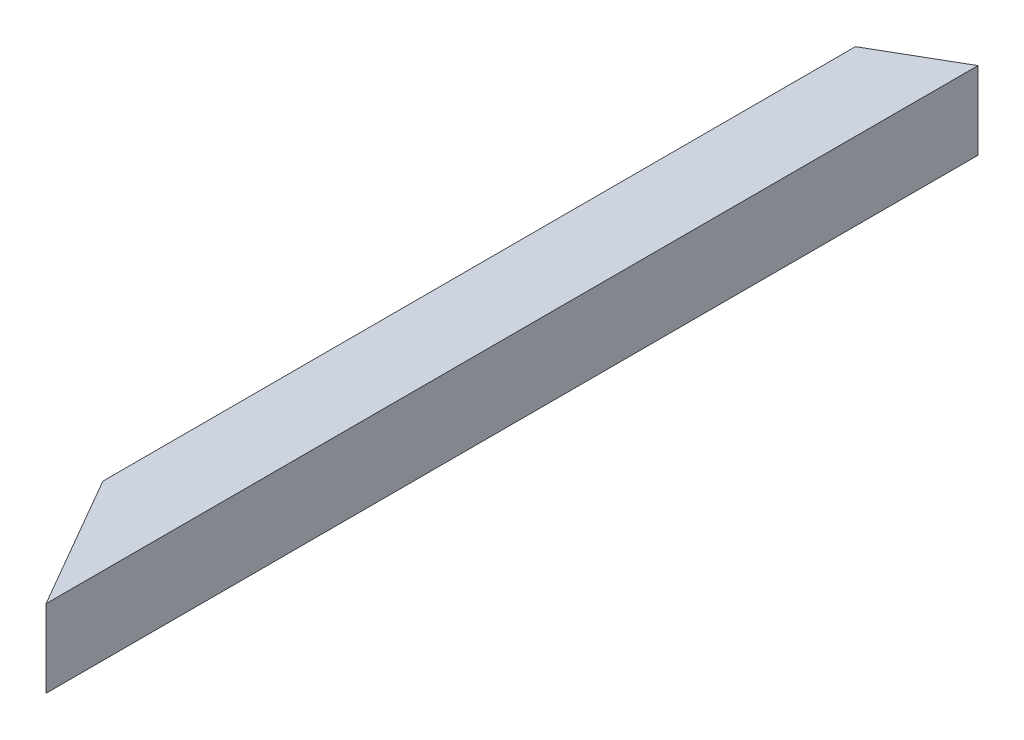
ISO-10303-21;
HEADER;
FILE_DESCRIPTION(('STEP AP214'),'2;1');
FILE_NAME('part.step','',(''),(''),'','','');
FILE_SCHEMA(('AUTOMOTIVE_DESIGN { 1 0 10303 214 1 1 1 1 }'));
ENDSEC;
DATA;
#1=APPLICATION_CONTEXT('core data for automotive mechanical design processes');
#2=APPLICATION_PROTOCOL_DEFINITION('international standard','automotive_design',2000,#1);
#3=PRODUCT_CONTEXT('',#1,'mechanical');
#4=PRODUCT('Part','Part','',(#3));
#5=PRODUCT_RELATED_PRODUCT_CATEGORY('part','',(#4));
#6=PRODUCT_DEFINITION_FORMATION('','',#4);
#7=PRODUCT_DEFINITION_CONTEXT('part definition',#1,'design');
#8=PRODUCT_DEFINITION('design','',#6,#7);
#9=PRODUCT_DEFINITION_SHAPE('','',#8);
#10=(LENGTH_UNIT() NAMED_UNIT(*) SI_UNIT(.MILLI.,.METRE.));
#11=(NAMED_UNIT(*) PLANE_ANGLE_UNIT() SI_UNIT($,.RADIAN.));
#12=(NAMED_UNIT(*) SI_UNIT($,.STERADIAN.) SOLID_ANGLE_UNIT());
#13=UNCERTAINTY_MEASURE_WITH_UNIT(LENGTH_MEASURE(1.E-05),#10,'distance_accuracy_value','');
#14=(GEOMETRIC_REPRESENTATION_CONTEXT(3) GLOBAL_UNCERTAINTY_ASSIGNED_CONTEXT((#13)) GLOBAL_UNIT_ASSIGNED_CONTEXT((#10,
#11,#12)) REPRESENTATION_CONTEXT('',''));
#15=CARTESIAN_POINT('',(0.,0.,0.));
#16=DIRECTION('',(0.,0.,1.));
#17=DIRECTION('',(1.,0.,0.));
#18=AXIS2_PLACEMENT_3D('',#15,#16,#17);
#19=CARTESIAN_POINT('',(1.,19.,240.));
#20=DIRECTION('',(0.,-1.,0.));
#21=DIRECTION('',(0.,0.,-1.));
#22=AXIS2_PLACEMENT_3D('',#19,#20,#21);
#23=PLANE('',#22);
#24=DIRECTION('',(-0.866025403784438,0.,0.500000000000001));
#25=VECTOR('',#24,1.);
#26=CARTESIAN_POINT('',(-98.1730484541328,19.,68.2272413359525));
#27=LINE('',#26,#25);
#28=CARTESIAN_POINT('',(19.,19.,0.577350269189675));
#29=VERTEX_POINT('',#28);
#30=CARTESIAN_POINT('',(0.999999999999987,19.,10.969655114603));
#31=VERTEX_POINT('',#30);
#32=EDGE_CURVE('E11',#29,#31,#27,.T.);
#33=ORIENTED_EDGE('',*,*,#32,.F.);
#34=DIRECTION('',(0.,0.,-1.));
#35=VECTOR('',#34,1.);
#36=CARTESIAN_POINT('',(19.,19.,240.));
#37=LINE('',#36,#35);
#38=CARTESIAN_POINT('',(19.,19.,238.267949192431));
#39=VERTEX_POINT('',#38);
#40=EDGE_CURVE('E142',#39,#29,#37,.T.);
#41=ORIENTED_EDGE('',*,*,#40,.F.);
#42=DIRECTION('',(0.500000000000005,0.,0.866025403784436));
#43=VECTOR('',#42,1.);
#44=CARTESIAN_POINT('',(15.2499999999999,19.,231.772758664048));
#45=LINE('',#44,#43);
#46=CARTESIAN_POINT('',(1.,19.,207.091034656192));
#47=VERTEX_POINT('',#46);
#48=EDGE_CURVE('E43',#47,#39,#45,.T.);
#49=ORIENTED_EDGE('',*,*,#48,.F.);
#50=DIRECTION('',(0.,0.,-1.));
#51=VECTOR('',#50,1.);
#52=CARTESIAN_POINT('',(1.,19.,240.));
#53=LINE('',#52,#51);
#54=EDGE_CURVE('E148',#47,#31,#53,.T.);
#55=ORIENTED_EDGE('',*,*,#54,.T.);
#56=EDGE_LOOP('',(#33,#41,#49,#55));
#57=FACE_BOUND('',#56,.T.);
#58=ADVANCED_FACE('F35',(#57),#23,.T.);
#59=CARTESIAN_POINT('',(19.,1.,240.));
#60=DIRECTION('',(-1.,0.,0.));
#61=DIRECTION('',(0.,0.,1.));
#62=AXIS2_PLACEMENT_3D('',#59,#60,#61);
#63=PLANE('',#62);
#64=DIRECTION('',(0.,1.,0.));
#65=VECTOR('',#64,1.);
#66=CARTESIAN_POINT('',(19.,1.,0.577350269189647));
#67=LINE('',#66,#65);
#68=CARTESIAN_POINT('',(19.,1.,0.577350269189647));
#69=VERTEX_POINT('',#68);
#70=EDGE_CURVE('E162',#69,#29,#67,.T.);
#71=ORIENTED_EDGE('',*,*,#70,.F.);
#72=DIRECTION('',(0.,0.,-1.));
#73=VECTOR('',#72,1.);
#74=CARTESIAN_POINT('',(19.,1.,240.));
#75=LINE('',#74,#73);
#76=CARTESIAN_POINT('',(19.,1.,238.267949192431));
#77=VERTEX_POINT('',#76);
#78=EDGE_CURVE('E144',#77,#69,#75,.T.);
#79=ORIENTED_EDGE('',*,*,#78,.F.);
#80=DIRECTION('',(0.,-1.,0.));
#81=VECTOR('',#80,1.);
#82=CARTESIAN_POINT('',(19.,1.,238.267949192431));
#83=LINE('',#82,#81);
#84=EDGE_CURVE('E131',#39,#77,#83,.T.);
#85=ORIENTED_EDGE('',*,*,#84,.F.);
#86=ORIENTED_EDGE('',*,*,#40,.T.);
#87=EDGE_LOOP('',(#71,#79,#85,#86));
#88=FACE_BOUND('',#87,.T.);
#89=ADVANCED_FACE('F141',(#88),#63,.T.);
#90=CARTESIAN_POINT('',(1.,1.,240.));
#91=DIRECTION('',(0.,1.,0.));
#92=DIRECTION('',(0.,0.,1.));
#93=AXIS2_PLACEMENT_3D('',#90,#91,#92);
#94=PLANE('',#93);
#95=DIRECTION('',(0.866025403784438,0.,-0.500000000000001));
#96=VECTOR('',#95,1.);
#97=CARTESIAN_POINT('',(-98.1730484541328,1.,68.2272413359525));
#98=LINE('',#97,#96);
#99=CARTESIAN_POINT('',(0.999999999999987,1.,10.969655114603));
#100=VERTEX_POINT('',#99);
#101=EDGE_CURVE('E166',#100,#69,#98,.T.);
#102=ORIENTED_EDGE('',*,*,#101,.F.);
#103=DIRECTION('',(0.,0.,-1.));
#104=VECTOR('',#103,1.);
#105=CARTESIAN_POINT('',(1.,1.,240.));
#106=LINE('',#105,#104);
#107=CARTESIAN_POINT('',(0.999999999999999,1.,207.091034656192));
#108=VERTEX_POINT('',#107);
#109=EDGE_CURVE('E116',#108,#100,#106,.T.);
#110=ORIENTED_EDGE('',*,*,#109,.F.);
#111=DIRECTION('',(-0.500000000000005,0.,-0.866025403784436));
#112=VECTOR('',#111,1.);
#113=CARTESIAN_POINT('',(15.2499999999999,1.,231.772758664048));
#114=LINE('',#113,#112);
#115=EDGE_CURVE('E145',#77,#108,#114,.T.);
#116=ORIENTED_EDGE('',*,*,#115,.F.);
#117=ORIENTED_EDGE('',*,*,#78,.T.);
#118=EDGE_LOOP('',(#102,#110,#116,#117));
#119=FACE_BOUND('',#118,.T.);
#120=ADVANCED_FACE('F188',(#119),#94,.T.);
#121=CARTESIAN_POINT('',(1.,1.,240.));
#122=DIRECTION('',(1.,0.,0.));
#123=DIRECTION('',(0.,0.,-1.));
#124=AXIS2_PLACEMENT_3D('',#121,#122,#123);
#125=PLANE('',#124);
#126=DIRECTION('',(0.,-1.,0.));
#127=VECTOR('',#126,1.);
#128=CARTESIAN_POINT('',(1.,1.,10.969655114603));
#129=LINE('',#128,#127);
#130=EDGE_CURVE('E165',#31,#100,#129,.T.);
#131=ORIENTED_EDGE('',*,*,#130,.F.);
#132=ORIENTED_EDGE('',*,*,#54,.F.);
#133=DIRECTION('',(0.,1.,0.));
#134=VECTOR('',#133,1.);
#135=CARTESIAN_POINT('',(1.,1.,207.091034656192));
#136=LINE('',#135,#134);
#137=EDGE_CURVE('E58',#108,#47,#136,.T.);
#138=ORIENTED_EDGE('',*,*,#137,.F.);
#139=ORIENTED_EDGE('',*,*,#109,.T.);
#140=EDGE_LOOP('',(#131,#132,#138,#139));
#141=FACE_BOUND('',#140,.T.);
#142=ADVANCED_FACE('F194',(#141),#125,.T.);
#143=CARTESIAN_POINT('',(0.,-280.,205.358983848623));
#144=DIRECTION('',(0.866025403784436,0.,-0.500000000000004));
#145=DIRECTION('',(-0.500000000000005,0.,-0.866025403784436));
#146=AXIS2_PLACEMENT_3D('',#143,#144,#145);
#147=PLANE('',#146);
#148=ORIENTED_EDGE('',*,*,#137,.T.);
#149=ORIENTED_EDGE('',*,*,#48,.T.);
#150=ORIENTED_EDGE('',*,*,#84,.T.);
#151=ORIENTED_EDGE('',*,*,#115,.T.);
#152=EDGE_LOOP('',(#148,#149,#150,#151));
#153=FACE_BOUND('',#152,.T.);
#154=DIRECTION('',(0.,1.,0.));
#155=VECTOR('',#154,1.);
#156=CARTESIAN_POINT('',(20.,0.,240.));
#157=LINE('',#156,#155);
#158=CARTESIAN_POINT('',(20.,0.,240.));
#159=VERTEX_POINT('',#158);
#160=CARTESIAN_POINT('',(20.,20.,240.));
#161=VERTEX_POINT('',#160);
#162=EDGE_CURVE('E115',#159,#161,#157,.T.);
#163=ORIENTED_EDGE('',*,*,#162,.T.);
#164=DIRECTION('',(-0.500000000000004,0.,-0.866025403784436));
#165=VECTOR('',#164,1.);
#166=CARTESIAN_POINT('',(0.,20.,205.358983848623));
#167=LINE('',#166,#165);
#168=CARTESIAN_POINT('',(0.,20.,205.358983848623));
#169=VERTEX_POINT('',#168);
#170=EDGE_CURVE('E120',#161,#169,#167,.T.);
#171=ORIENTED_EDGE('',*,*,#170,.T.);
#172=DIRECTION('',(0.,1.,0.));
#173=VECTOR('',#172,1.);
#174=CARTESIAN_POINT('',(0.,-280.,205.358983848623));
#175=LINE('',#174,#173);
#176=CARTESIAN_POINT('',(0.,0.,205.358983848623));
#177=VERTEX_POINT('',#176);
#178=EDGE_CURVE('E105',#177,#169,#175,.T.);
#179=ORIENTED_EDGE('',*,*,#178,.F.);
#180=DIRECTION('',(-0.500000000000005,0.,-0.866025403784436));
#181=VECTOR('',#180,1.);
#182=CARTESIAN_POINT('',(14.9999999999999,0.,231.339745962156));
#183=LINE('',#182,#181);
#184=EDGE_CURVE('E159',#159,#177,#183,.T.);
#185=ORIENTED_EDGE('',*,*,#184,.F.);
#186=EDGE_LOOP('',(#163,#171,#179,#185));
#187=FACE_BOUND('',#186,.T.);
#188=ADVANCED_FACE('F129',(#153,#187),#147,.F.);
#189=CARTESIAN_POINT('',(20.,-280.,0.));
#190=DIRECTION('',(0.500000000000001,0.,0.866025403784438));
#191=DIRECTION('',(0.866025403784438,0.,-0.500000000000001));
#192=AXIS2_PLACEMENT_3D('',#189,#190,#191);
#193=PLANE('',#192);
#194=ORIENTED_EDGE('',*,*,#130,.T.);
#195=ORIENTED_EDGE('',*,*,#101,.T.);
#196=ORIENTED_EDGE('',*,*,#70,.T.);
#197=ORIENTED_EDGE('',*,*,#32,.T.);
#198=EDGE_LOOP('',(#194,#195,#196,#197));
#199=FACE_BOUND('',#198,.T.);
#200=DIRECTION('',(0.,1.,0.));
#201=VECTOR('',#200,1.);
#202=CARTESIAN_POINT('',(0.,-280.,11.5470053837926));
#203=LINE('',#202,#201);
#204=CARTESIAN_POINT('',(0.,0.,11.5470053837926));
#205=VERTEX_POINT('',#204);
#206=CARTESIAN_POINT('',(0.,20.,11.5470053837926));
#207=VERTEX_POINT('',#206);
#208=EDGE_CURVE('E50',#205,#207,#203,.T.);
#209=ORIENTED_EDGE('',*,*,#208,.T.);
#210=DIRECTION('',(0.866025403784438,0.,-0.500000000000001));
#211=VECTOR('',#210,1.);
#212=CARTESIAN_POINT('',(20.,20.,0.));
#213=LINE('',#212,#211);
#214=CARTESIAN_POINT('',(20.,20.,0.));
#215=VERTEX_POINT('',#214);
#216=EDGE_CURVE('E96',#207,#215,#213,.T.);
#217=ORIENTED_EDGE('',*,*,#216,.T.);
#218=DIRECTION('',(0.,1.,0.));
#219=VECTOR('',#218,1.);
#220=CARTESIAN_POINT('',(20.,0.,0.));
#221=LINE('',#220,#219);
#222=CARTESIAN_POINT('',(20.,0.,0.));
#223=VERTEX_POINT('',#222);
#224=EDGE_CURVE('E99',#223,#215,#221,.T.);
#225=ORIENTED_EDGE('',*,*,#224,.F.);
#226=DIRECTION('',(0.866025403784438,0.,-0.500000000000001));
#227=VECTOR('',#226,1.);
#228=CARTESIAN_POINT('',(-98.9230484541328,0.,68.6602540378447));
#229=LINE('',#228,#227);
#230=EDGE_CURVE('E151',#205,#223,#229,.T.);
#231=ORIENTED_EDGE('',*,*,#230,.F.);
#232=EDGE_LOOP('',(#209,#217,#225,#231));
#233=FACE_BOUND('',#232,.T.);
#234=ADVANCED_FACE('F98',(#199,#233),#193,.F.);
#235=CARTESIAN_POINT('',(0.,0.,240.));
#236=DIRECTION('',(1.,0.,0.));
#237=DIRECTION('',(0.,0.,-1.));
#238=AXIS2_PLACEMENT_3D('',#235,#236,#237);
#239=PLANE('',#238);
#240=DIRECTION('',(0.,0.,-1.));
#241=VECTOR('',#240,1.);
#242=CARTESIAN_POINT('',(0.,20.,240.));
#243=LINE('',#242,#241);
#244=EDGE_CURVE('E121',#169,#207,#243,.T.);
#245=ORIENTED_EDGE('',*,*,#244,.T.);
#246=ORIENTED_EDGE('',*,*,#208,.F.);
#247=DIRECTION('',(0.,0.,-1.));
#248=VECTOR('',#247,1.);
#249=CARTESIAN_POINT('',(0.,0.,240.));
#250=LINE('',#249,#248);
#251=EDGE_CURVE('E123',#177,#205,#250,.T.);
#252=ORIENTED_EDGE('',*,*,#251,.F.);
#253=ORIENTED_EDGE('',*,*,#178,.T.);
#254=EDGE_LOOP('',(#245,#246,#252,#253));
#255=FACE_BOUND('',#254,.T.);
#256=ADVANCED_FACE('F37',(#255),#239,.F.);
#257=CARTESIAN_POINT('',(0.,0.,240.));
#258=DIRECTION('',(0.,1.,0.));
#259=DIRECTION('',(0.,0.,1.));
#260=AXIS2_PLACEMENT_3D('',#257,#258,#259);
#261=PLANE('',#260);
#262=ORIENTED_EDGE('',*,*,#251,.T.);
#263=ORIENTED_EDGE('',*,*,#230,.T.);
#264=DIRECTION('',(0.,0.,-1.));
#265=VECTOR('',#264,1.);
#266=CARTESIAN_POINT('',(20.,0.,240.));
#267=LINE('',#266,#265);
#268=EDGE_CURVE('E114',#159,#223,#267,.T.);
#269=ORIENTED_EDGE('',*,*,#268,.F.);
#270=ORIENTED_EDGE('',*,*,#184,.T.);
#271=EDGE_LOOP('',(#262,#263,#269,#270));
#272=FACE_BOUND('',#271,.T.);
#273=ADVANCED_FACE('F164',(#272),#261,.F.);
#274=CARTESIAN_POINT('',(20.,0.,240.));
#275=DIRECTION('',(-1.,0.,0.));
#276=DIRECTION('',(0.,0.,1.));
#277=AXIS2_PLACEMENT_3D('',#274,#275,#276);
#278=PLANE('',#277);
#279=ORIENTED_EDGE('',*,*,#224,.T.);
#280=DIRECTION('',(0.,0.,-1.));
#281=VECTOR('',#280,1.);
#282=CARTESIAN_POINT('',(20.,20.,240.));
#283=LINE('',#282,#281);
#284=EDGE_CURVE('E112',#161,#215,#283,.T.);
#285=ORIENTED_EDGE('',*,*,#284,.F.);
#286=ORIENTED_EDGE('',*,*,#162,.F.);
#287=ORIENTED_EDGE('',*,*,#268,.T.);
#288=EDGE_LOOP('',(#279,#285,#286,#287));
#289=FACE_BOUND('',#288,.T.);
#290=ADVANCED_FACE('F110',(#289),#278,.F.);
#291=CARTESIAN_POINT('',(0.,20.,240.));
#292=DIRECTION('',(0.,-1.,0.));
#293=DIRECTION('',(0.,0.,-1.));
#294=AXIS2_PLACEMENT_3D('',#291,#292,#293);
#295=PLANE('',#294);
#296=ORIENTED_EDGE('',*,*,#284,.T.);
#297=ORIENTED_EDGE('',*,*,#216,.F.);
#298=ORIENTED_EDGE('',*,*,#244,.F.);
#299=ORIENTED_EDGE('',*,*,#170,.F.);
#300=EDGE_LOOP('',(#296,#297,#298,#299));
#301=FACE_BOUND('',#300,.T.);
#302=ADVANCED_FACE('F119',(#301),#295,.F.);
#303=CLOSED_SHELL('',(#58,#89,#120,#142,#188,#234,#256,#273,#290,#302));
#304=MANIFOLD_SOLID_BREP('B2',#303);
#305=ADVANCED_BREP_SHAPE_REPRESENTATION('',(#18,#304),#14);
#306=SHAPE_DEFINITION_REPRESENTATION(#9,#305);
ENDSEC;
END-ISO-10303-21;
